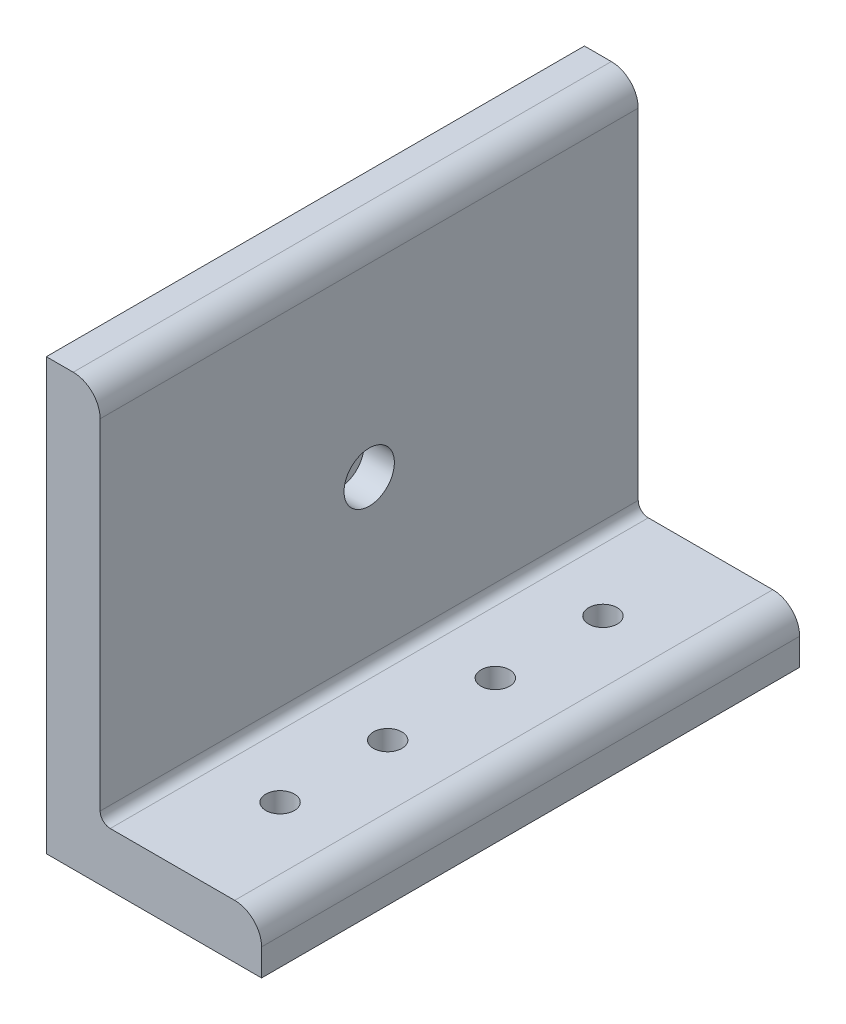
ISO-10303-21;
HEADER;
FILE_DESCRIPTION(('STEP AP214'),'2;1');
FILE_NAME('part.step','',(''),(''),'','','');
FILE_SCHEMA(('AUTOMOTIVE_DESIGN { 1 0 10303 214 1 1 1 1 }'));
ENDSEC;
DATA;
#1=APPLICATION_CONTEXT('core data for automotive mechanical design processes');
#2=APPLICATION_PROTOCOL_DEFINITION('international standard','automotive_design',2000,#1);
#3=PRODUCT_CONTEXT('',#1,'mechanical');
#4=PRODUCT('Part','Part','',(#3));
#5=PRODUCT_RELATED_PRODUCT_CATEGORY('part','',(#4));
#6=PRODUCT_DEFINITION_FORMATION('','',#4);
#7=PRODUCT_DEFINITION_CONTEXT('part definition',#1,'design');
#8=PRODUCT_DEFINITION('design','',#6,#7);
#9=PRODUCT_DEFINITION_SHAPE('','',#8);
#10=(LENGTH_UNIT() NAMED_UNIT(*) SI_UNIT(.MILLI.,.METRE.));
#11=(NAMED_UNIT(*) PLANE_ANGLE_UNIT() SI_UNIT($,.RADIAN.));
#12=(NAMED_UNIT(*) SI_UNIT($,.STERADIAN.) SOLID_ANGLE_UNIT());
#13=UNCERTAINTY_MEASURE_WITH_UNIT(LENGTH_MEASURE(1.E-05),#10,'distance_accuracy_value','');
#14=(GEOMETRIC_REPRESENTATION_CONTEXT(3) GLOBAL_UNCERTAINTY_ASSIGNED_CONTEXT((#13)) GLOBAL_UNIT_ASSIGNED_CONTEXT((#10,
#11,#12)) REPRESENTATION_CONTEXT('',''));
#15=CARTESIAN_POINT('',(0.,0.,0.));
#16=DIRECTION('',(0.,0.,1.));
#17=DIRECTION('',(1.,0.,0.));
#18=AXIS2_PLACEMENT_3D('',#15,#16,#17);
#19=CARTESIAN_POINT('',(421.099925431454,-195.774980879017,94.9361036958903));
#20=DIRECTION('',(0.,-1.,0.));
#21=DIRECTION('',(0.,0.,-1.));
#22=AXIS2_PLACEMENT_3D('',#19,#20,#21);
#23=PLANE('',#22);
#24=CARTESIAN_POINT('',(450.471215431454,-195.774980879017,-108.26389630411));
#25=DIRECTION('',(0.,1.,0.));
#26=DIRECTION('',(0.,0.,1.));
#27=AXIS2_PLACEMENT_3D('',#24,#25,#26);
#28=CIRCLE('',#27,6.74624000000001);
#29=CARTESIAN_POINT('',(450.471215431454,-195.774980879017,-101.51765630411));
#30=VERTEX_POINT('',#29);
#31=EDGE_CURVE('E295',#30,#30,#28,.T.);
#32=ORIENTED_EDGE('',*,*,#31,.F.);
#33=EDGE_LOOP('',(#32));
#34=FACE_BOUND('',#33,.T.);
#35=CARTESIAN_POINT('',(450.471215431454,-195.774980879017,-57.4638963041097));
#36=DIRECTION('',(0.,1.,0.));
#37=DIRECTION('',(0.,0.,1.));
#38=AXIS2_PLACEMENT_3D('',#35,#36,#37);
#39=CIRCLE('',#38,6.74624000000001);
#40=CARTESIAN_POINT('',(450.471215431454,-195.774980879017,-50.7176563041097));
#41=VERTEX_POINT('',#40);
#42=EDGE_CURVE('E287',#41,#41,#39,.T.);
#43=ORIENTED_EDGE('',*,*,#42,.F.);
#44=EDGE_LOOP('',(#43));
#45=FACE_BOUND('',#44,.T.);
#46=CARTESIAN_POINT('',(450.471215431454,-195.774980879017,44.1361036958903));
#47=DIRECTION('',(0.,1.,0.));
#48=DIRECTION('',(0.,0.,1.));
#49=AXIS2_PLACEMENT_3D('',#46,#47,#48);
#50=CIRCLE('',#49,6.74624000000001);
#51=CARTESIAN_POINT('',(450.471215431454,-195.774980879017,50.8823436958903));
#52=VERTEX_POINT('',#51);
#53=EDGE_CURVE('E271',#52,#52,#50,.T.);
#54=ORIENTED_EDGE('',*,*,#53,.F.);
#55=EDGE_LOOP('',(#54));
#56=FACE_BOUND('',#55,.T.);
#57=DIRECTION('',(-1.,0.,0.));
#58=VECTOR('',#57,1.);
#59=CARTESIAN_POINT('',(421.099925431454,-195.774980879017,-159.06389630411));
#60=LINE('',#59,#58);
#61=CARTESIAN_POINT('',(479.842505431454,-195.774980879017,-159.06389630411));
#62=VERTEX_POINT('',#61);
#63=CARTESIAN_POINT('',(421.099925431454,-195.774980879017,-159.06389630411));
#64=VERTEX_POINT('',#63);
#65=EDGE_CURVE('E197',#62,#64,#60,.T.);
#66=ORIENTED_EDGE('',*,*,#65,.T.);
#67=DIRECTION('',(0.,0.,-1.));
#68=VECTOR('',#67,1.);
#69=CARTESIAN_POINT('',(421.099925431454,-195.774980879017,94.9361036958903));
#70=LINE('',#69,#68);
#71=CARTESIAN_POINT('',(421.099925431454,-195.774980879017,94.9361036958903));
#72=VERTEX_POINT('',#71);
#73=EDGE_CURVE('E223',#72,#64,#70,.T.);
#74=ORIENTED_EDGE('',*,*,#73,.F.);
#75=DIRECTION('',(-1.,0.,0.));
#76=VECTOR('',#75,1.);
#77=CARTESIAN_POINT('',(421.099925431454,-195.774980879017,94.9361036958903));
#78=LINE('',#77,#76);
#79=CARTESIAN_POINT('',(479.842505431454,-195.774980879017,94.9361036958903));
#80=VERTEX_POINT('',#79);
#81=EDGE_CURVE('E255',#80,#72,#78,.T.);
#82=ORIENTED_EDGE('',*,*,#81,.F.);
#83=DIRECTION('',(0.,0.,-1.));
#84=VECTOR('',#83,1.);
#85=CARTESIAN_POINT('',(479.842505431454,-195.774980879017,94.9361036958903));
#86=LINE('',#85,#84);
#87=EDGE_CURVE('E227',#80,#62,#86,.T.);
#88=ORIENTED_EDGE('',*,*,#87,.T.);
#89=EDGE_LOOP('',(#66,#74,#82,#88));
#90=FACE_BOUND('',#89,.T.);
#91=CARTESIAN_POINT('',(450.471215431454,-195.774980879017,-6.66389630410971));
#92=DIRECTION('',(0.,1.,0.));
#93=DIRECTION('',(0.,0.,1.));
#94=AXIS2_PLACEMENT_3D('',#91,#92,#93);
#95=CIRCLE('',#94,6.74624000000001);
#96=CARTESIAN_POINT('',(450.471215431454,-195.774980879017,0.0823436958903023));
#97=VERTEX_POINT('',#96);
#98=EDGE_CURVE('E279',#97,#97,#95,.T.);
#99=ORIENTED_EDGE('',*,*,#98,.F.);
#100=EDGE_LOOP('',(#99));
#101=FACE_BOUND('',#100,.T.);
#102=ADVANCED_FACE('F77',(#34,#45,#56,#90,#101),#23,.F.);
#103=CARTESIAN_POINT('',(492.537425431454,-221.174980879017,94.9361036958903));
#104=DIRECTION('',(0.,1.,0.));
#105=DIRECTION('',(0.,0.,1.));
#106=AXIS2_PLACEMENT_3D('',#103,#104,#105);
#107=PLANE('',#106);
#108=CARTESIAN_POINT('',(450.471215431454,-221.174980879017,-108.26389630411));
#109=DIRECTION('',(0.,1.,0.));
#110=DIRECTION('',(0.,0.,1.));
#111=AXIS2_PLACEMENT_3D('',#108,#109,#110);
#112=CIRCLE('',#111,6.74624000000001);
#113=CARTESIAN_POINT('',(450.471215431454,-221.174980879017,-101.51765630411));
#114=VERTEX_POINT('',#113);
#115=EDGE_CURVE('E291',#114,#114,#112,.T.);
#116=ORIENTED_EDGE('',*,*,#115,.T.);
#117=EDGE_LOOP('',(#116));
#118=FACE_BOUND('',#117,.T.);
#119=CARTESIAN_POINT('',(450.471215431454,-221.174980879017,-57.4638963041097));
#120=DIRECTION('',(0.,1.,0.));
#121=DIRECTION('',(0.,0.,1.));
#122=AXIS2_PLACEMENT_3D('',#119,#120,#121);
#123=CIRCLE('',#122,6.74624000000001);
#124=CARTESIAN_POINT('',(450.471215431454,-221.174980879017,-50.7176563041097));
#125=VERTEX_POINT('',#124);
#126=EDGE_CURVE('E283',#125,#125,#123,.T.);
#127=ORIENTED_EDGE('',*,*,#126,.T.);
#128=EDGE_LOOP('',(#127));
#129=FACE_BOUND('',#128,.T.);
#130=CARTESIAN_POINT('',(450.471215431454,-221.174980879017,-6.66389630410971));
#131=DIRECTION('',(0.,1.,0.));
#132=DIRECTION('',(0.,0.,1.));
#133=AXIS2_PLACEMENT_3D('',#130,#131,#132);
#134=CIRCLE('',#133,6.74624000000001);
#135=CARTESIAN_POINT('',(450.471215431454,-221.174980879017,0.0823436958903023));
#136=VERTEX_POINT('',#135);
#137=EDGE_CURVE('E275',#136,#136,#134,.T.);
#138=ORIENTED_EDGE('',*,*,#137,.T.);
#139=EDGE_LOOP('',(#138));
#140=FACE_BOUND('',#139,.T.);
#141=CARTESIAN_POINT('',(450.471215431454,-221.174980879017,44.1361036958903));
#142=DIRECTION('',(0.,1.,0.));
#143=DIRECTION('',(0.,0.,1.));
#144=AXIS2_PLACEMENT_3D('',#141,#142,#143);
#145=CIRCLE('',#144,6.74624000000001);
#146=CARTESIAN_POINT('',(450.471215431454,-221.174980879017,50.8823436958903));
#147=VERTEX_POINT('',#146);
#148=EDGE_CURVE('E191',#147,#147,#145,.T.);
#149=ORIENTED_EDGE('',*,*,#148,.T.);
#150=EDGE_LOOP('',(#149));
#151=FACE_BOUND('',#150,.T.);
#152=DIRECTION('',(1.,0.,0.));
#153=VECTOR('',#152,1.);
#154=CARTESIAN_POINT('',(492.537425431454,-221.174980879017,-159.06389630411));
#155=LINE('',#154,#153);
#156=CARTESIAN_POINT('',(390.937425431454,-221.174980879017,-159.06389630411));
#157=VERTEX_POINT('',#156);
#158=CARTESIAN_POINT('',(492.537425431454,-221.174980879017,-159.06389630411));
#159=VERTEX_POINT('',#158);
#160=EDGE_CURVE('E186',#157,#159,#155,.T.);
#161=ORIENTED_EDGE('',*,*,#160,.T.);
#162=DIRECTION('',(0.,0.,-1.));
#163=VECTOR('',#162,1.);
#164=CARTESIAN_POINT('',(492.537425431454,-221.174980879017,94.9361036958903));
#165=LINE('',#164,#163);
#166=CARTESIAN_POINT('',(492.537425431454,-221.174980879017,94.9361036958903));
#167=VERTEX_POINT('',#166);
#168=EDGE_CURVE('E13',#167,#159,#165,.T.);
#169=ORIENTED_EDGE('',*,*,#168,.F.);
#170=DIRECTION('',(1.,0.,0.));
#171=VECTOR('',#170,1.);
#172=CARTESIAN_POINT('',(492.537425431454,-221.174980879017,94.9361036958903));
#173=LINE('',#172,#171);
#174=CARTESIAN_POINT('',(390.937425431454,-221.174980879017,94.9361036958903));
#175=VERTEX_POINT('',#174);
#176=EDGE_CURVE('E212',#175,#167,#173,.T.);
#177=ORIENTED_EDGE('',*,*,#176,.F.);
#178=DIRECTION('',(0.,0.,-1.));
#179=VECTOR('',#178,1.);
#180=CARTESIAN_POINT('',(390.937425431454,-221.174980879017,94.9361036958903));
#181=LINE('',#180,#179);
#182=EDGE_CURVE('E182',#175,#157,#181,.T.);
#183=ORIENTED_EDGE('',*,*,#182,.T.);
#184=EDGE_LOOP('',(#161,#169,#177,#183));
#185=FACE_BOUND('',#184,.T.);
#186=ADVANCED_FACE('F79',(#118,#129,#140,#151,#185),#107,.F.);
#187=CARTESIAN_POINT('',(492.537425431454,-208.469900879017,94.9361036958903));
#188=DIRECTION('',(-1.,0.,0.));
#189=DIRECTION('',(0.,0.,1.));
#190=AXIS2_PLACEMENT_3D('',#187,#188,#189);
#191=PLANE('',#190);
#192=DIRECTION('',(0.,1.,0.));
#193=VECTOR('',#192,1.);
#194=CARTESIAN_POINT('',(492.537425431454,-208.469900879017,-159.06389630411));
#195=LINE('',#194,#193);
#196=CARTESIAN_POINT('',(492.537425431454,-208.469900879017,-159.06389630411));
#197=VERTEX_POINT('',#196);
#198=EDGE_CURVE('E190',#159,#197,#195,.T.);
#199=ORIENTED_EDGE('',*,*,#198,.T.);
#200=DIRECTION('',(0.,0.,-1.));
#201=VECTOR('',#200,1.);
#202=CARTESIAN_POINT('',(492.537425431454,-208.469900879017,94.9361036958903));
#203=LINE('',#202,#201);
#204=CARTESIAN_POINT('',(492.537425431454,-208.469900879017,94.9361036958903));
#205=VERTEX_POINT('',#204);
#206=EDGE_CURVE('E87',#205,#197,#203,.T.);
#207=ORIENTED_EDGE('',*,*,#206,.F.);
#208=DIRECTION('',(0.,1.,0.));
#209=VECTOR('',#208,1.);
#210=CARTESIAN_POINT('',(492.537425431454,-208.469900879017,94.9361036958903));
#211=LINE('',#210,#209);
#212=EDGE_CURVE('E141',#167,#205,#211,.T.);
#213=ORIENTED_EDGE('',*,*,#212,.F.);
#214=ORIENTED_EDGE('',*,*,#168,.T.);
#215=EDGE_LOOP('',(#199,#207,#213,#214));
#216=FACE_BOUND('',#215,.T.);
#217=ADVANCED_FACE('F345',(#216),#191,.F.);
#218=CARTESIAN_POINT('',(479.842505431454,-208.469900879017,94.9361036958903));
#219=DIRECTION('',(0.,0.,-1.));
#220=DIRECTION('',(-1.,0.,0.));
#221=AXIS2_PLACEMENT_3D('',#218,#219,#220);
#222=CYLINDRICAL_SURFACE('',#221,12.69492);
#223=CARTESIAN_POINT('',(479.842505431454,-208.469900879017,-159.06389630411));
#224=DIRECTION('',(0.,0.,1.));
#225=DIRECTION('',(1.,0.,0.));
#226=AXIS2_PLACEMENT_3D('',#223,#224,#225);
#227=CIRCLE('',#226,12.69492);
#228=EDGE_CURVE('E194',#197,#62,#227,.T.);
#229=ORIENTED_EDGE('',*,*,#228,.T.);
#230=ORIENTED_EDGE('',*,*,#87,.F.);
#231=CARTESIAN_POINT('',(479.842505431454,-208.469900879017,94.9361036958903));
#232=DIRECTION('',(0.,0.,1.));
#233=DIRECTION('',(1.,0.,0.));
#234=AXIS2_PLACEMENT_3D('',#231,#232,#233);
#235=CIRCLE('',#234,12.69492);
#236=EDGE_CURVE('E238',#205,#80,#235,.T.);
#237=ORIENTED_EDGE('',*,*,#236,.F.);
#238=ORIENTED_EDGE('',*,*,#206,.T.);
#239=EDGE_LOOP('',(#229,#230,#237,#238));
#240=FACE_BOUND('',#239,.T.);
#241=ADVANCED_FACE('F236',(#240),#222,.T.);
#242=CARTESIAN_POINT('',(421.099925431454,-191.012480879017,94.9361036958903));
#243=DIRECTION('',(0.,0.,-1.));
#244=DIRECTION('',(-1.,0.,0.));
#245=AXIS2_PLACEMENT_3D('',#242,#243,#244);
#246=CYLINDRICAL_SURFACE('',#245,4.7625);
#247=CARTESIAN_POINT('',(421.099925431454,-191.012480879017,-159.06389630411));
#248=DIRECTION('',(0.,0.,-1.));
#249=DIRECTION('',(-1.,0.,0.));
#250=AXIS2_PLACEMENT_3D('',#247,#248,#249);
#251=CIRCLE('',#250,4.7625);
#252=CARTESIAN_POINT('',(416.337425431454,-191.012480879017,-159.06389630411));
#253=VERTEX_POINT('',#252);
#254=EDGE_CURVE('E200',#64,#253,#251,.T.);
#255=ORIENTED_EDGE('',*,*,#254,.T.);
#256=DIRECTION('',(0.,0.,-1.));
#257=VECTOR('',#256,1.);
#258=CARTESIAN_POINT('',(416.337425431454,-191.012480879017,94.9361036958903));
#259=LINE('',#258,#257);
#260=CARTESIAN_POINT('',(416.337425431454,-191.012480879017,94.9361036958903));
#261=VERTEX_POINT('',#260);
#262=EDGE_CURVE('E219',#261,#253,#259,.T.);
#263=ORIENTED_EDGE('',*,*,#262,.F.);
#264=CARTESIAN_POINT('',(421.099925431454,-191.012480879017,94.9361036958903));
#265=DIRECTION('',(0.,0.,-1.));
#266=DIRECTION('',(-1.,0.,0.));
#267=AXIS2_PLACEMENT_3D('',#264,#265,#266);
#268=CIRCLE('',#267,4.7625);
#269=EDGE_CURVE('E253',#72,#261,#268,.T.);
#270=ORIENTED_EDGE('',*,*,#269,.F.);
#271=ORIENTED_EDGE('',*,*,#73,.T.);
#272=EDGE_LOOP('',(#255,#263,#270,#271));
#273=FACE_BOUND('',#272,.T.);
#274=ADVANCED_FACE('F251',(#273),#246,.F.);
#275=CARTESIAN_POINT('',(416.337425431454,-30.6699008790166,94.9361036958903));
#276=DIRECTION('',(-1.,0.,0.));
#277=DIRECTION('',(0.,0.,1.));
#278=AXIS2_PLACEMENT_3D('',#275,#276,#277);
#279=PLANE('',#278);
#280=CARTESIAN_POINT('',(416.337425431454,-118.000180879017,-32.0638963041097));
#281=DIRECTION('',(1.,0.,0.));
#282=DIRECTION('',(0.,0.,-1.));
#283=AXIS2_PLACEMENT_3D('',#280,#281,#282);
#284=CIRCLE('',#283,11.89);
#285=CARTESIAN_POINT('',(416.337425431454,-118.000180879017,-43.9538963041097));
#286=VERTEX_POINT('',#285);
#287=EDGE_CURVE('E311',#286,#286,#284,.T.);
#288=ORIENTED_EDGE('',*,*,#287,.F.);
#289=EDGE_LOOP('',(#288));
#290=FACE_BOUND('',#289,.T.);
#291=DIRECTION('',(0.,1.,0.));
#292=VECTOR('',#291,1.);
#293=CARTESIAN_POINT('',(416.337425431454,-30.6699008790166,-159.06389630411));
#294=LINE('',#293,#292);
#295=CARTESIAN_POINT('',(416.337425431454,-30.6699008790166,-159.06389630411));
#296=VERTEX_POINT('',#295);
#297=EDGE_CURVE('E203',#253,#296,#294,.T.);
#298=ORIENTED_EDGE('',*,*,#297,.T.);
#299=DIRECTION('',(0.,0.,-1.));
#300=VECTOR('',#299,1.);
#301=CARTESIAN_POINT('',(416.337425431454,-30.6699008790166,94.9361036958903));
#302=LINE('',#301,#300);
#303=CARTESIAN_POINT('',(416.337425431454,-30.6699008790166,94.9361036958903));
#304=VERTEX_POINT('',#303);
#305=EDGE_CURVE('E174',#304,#296,#302,.T.);
#306=ORIENTED_EDGE('',*,*,#305,.F.);
#307=DIRECTION('',(0.,1.,0.));
#308=VECTOR('',#307,1.);
#309=CARTESIAN_POINT('',(416.337425431454,-30.6699008790166,94.9361036958903));
#310=LINE('',#309,#308);
#311=EDGE_CURVE('E163',#261,#304,#310,.T.);
#312=ORIENTED_EDGE('',*,*,#311,.F.);
#313=ORIENTED_EDGE('',*,*,#262,.T.);
#314=EDGE_LOOP('',(#298,#306,#312,#313));
#315=FACE_BOUND('',#314,.T.);
#316=ADVANCED_FACE('F319',(#290,#315),#279,.F.);
#317=CARTESIAN_POINT('',(403.642505431454,-30.6699008790166,94.9361036958903));
#318=DIRECTION('',(0.,0.,-1.));
#319=DIRECTION('',(-1.,0.,0.));
#320=AXIS2_PLACEMENT_3D('',#317,#318,#319);
#321=CYLINDRICAL_SURFACE('',#320,12.69492);
#322=CARTESIAN_POINT('',(403.642505431454,-30.6699008790166,-159.06389630411));
#323=DIRECTION('',(0.,0.,1.));
#324=DIRECTION('',(-1.,0.,0.));
#325=AXIS2_PLACEMENT_3D('',#322,#323,#324);
#326=CIRCLE('',#325,12.69492);
#327=CARTESIAN_POINT('',(403.642505431454,-17.9749808790166,-159.06389630411));
#328=VERTEX_POINT('',#327);
#329=EDGE_CURVE('E172',#296,#328,#326,.T.);
#330=ORIENTED_EDGE('',*,*,#329,.T.);
#331=DIRECTION('',(0.,0.,-1.));
#332=VECTOR('',#331,1.);
#333=CARTESIAN_POINT('',(403.642505431454,-17.9749808790166,94.9361036958903));
#334=LINE('',#333,#332);
#335=CARTESIAN_POINT('',(403.642505431454,-17.9749808790166,94.9361036958903));
#336=VERTEX_POINT('',#335);
#337=EDGE_CURVE('E169',#336,#328,#334,.T.);
#338=ORIENTED_EDGE('',*,*,#337,.F.);
#339=CARTESIAN_POINT('',(403.642505431454,-30.6699008790166,94.9361036958903));
#340=DIRECTION('',(0.,0.,1.));
#341=DIRECTION('',(-1.,0.,0.));
#342=AXIS2_PLACEMENT_3D('',#339,#340,#341);
#343=CIRCLE('',#342,12.69492);
#344=EDGE_CURVE('E157',#304,#336,#343,.T.);
#345=ORIENTED_EDGE('',*,*,#344,.F.);
#346=ORIENTED_EDGE('',*,*,#305,.T.);
#347=EDGE_LOOP('',(#330,#338,#345,#346));
#348=FACE_BOUND('',#347,.T.);
#349=ADVANCED_FACE('F170',(#348),#321,.T.);
#350=CARTESIAN_POINT('',(390.937425431454,-17.9749808790166,94.9361036958903));
#351=DIRECTION('',(0.,-1.,0.));
#352=DIRECTION('',(0.,0.,-1.));
#353=AXIS2_PLACEMENT_3D('',#350,#351,#352);
#354=PLANE('',#353);
#355=DIRECTION('',(-1.,0.,0.));
#356=VECTOR('',#355,1.);
#357=CARTESIAN_POINT('',(390.937425431454,-17.9749808790166,-159.06389630411));
#358=LINE('',#357,#356);
#359=CARTESIAN_POINT('',(390.937425431454,-17.9749808790166,-159.06389630411));
#360=VERTEX_POINT('',#359);
#361=EDGE_CURVE('E127',#328,#360,#358,.T.);
#362=ORIENTED_EDGE('',*,*,#361,.T.);
#363=DIRECTION('',(0.,0.,-1.));
#364=VECTOR('',#363,1.);
#365=CARTESIAN_POINT('',(390.937425431454,-17.9749808790166,94.9361036958903));
#366=LINE('',#365,#364);
#367=CARTESIAN_POINT('',(390.937425431454,-17.9749808790166,94.9361036958903));
#368=VERTEX_POINT('',#367);
#369=EDGE_CURVE('E175',#368,#360,#366,.T.);
#370=ORIENTED_EDGE('',*,*,#369,.F.);
#371=DIRECTION('',(-1.,0.,0.));
#372=VECTOR('',#371,1.);
#373=CARTESIAN_POINT('',(390.937425431454,-17.9749808790166,94.9361036958903));
#374=LINE('',#373,#372);
#375=EDGE_CURVE('E161',#336,#368,#374,.T.);
#376=ORIENTED_EDGE('',*,*,#375,.F.);
#377=ORIENTED_EDGE('',*,*,#337,.T.);
#378=EDGE_LOOP('',(#362,#370,#376,#377));
#379=FACE_BOUND('',#378,.T.);
#380=ADVANCED_FACE('F177',(#379),#354,.F.);
#381=CARTESIAN_POINT('',(390.937425431454,-221.174980879017,94.9361036958903));
#382=DIRECTION('',(1.,0.,0.));
#383=DIRECTION('',(0.,1.,0.));
#384=AXIS2_PLACEMENT_3D('',#381,#382,#383);
#385=PLANE('',#384);
#386=CARTESIAN_POINT('',(390.937425431454,-118.000180879017,-32.0638963041097));
#387=DIRECTION('',(1.,0.,0.));
#388=DIRECTION('',(0.,0.,-1.));
#389=AXIS2_PLACEMENT_3D('',#386,#387,#388);
#390=CIRCLE('',#389,6.74999999999999);
#391=CARTESIAN_POINT('',(390.937425431454,-118.000180879017,-38.8138963041097));
#392=VERTEX_POINT('',#391);
#393=EDGE_CURVE('E299',#392,#392,#390,.T.);
#394=ORIENTED_EDGE('',*,*,#393,.T.);
#395=EDGE_LOOP('',(#394));
#396=FACE_BOUND('',#395,.T.);
#397=DIRECTION('',(0.,-1.,0.));
#398=VECTOR('',#397,1.);
#399=CARTESIAN_POINT('',(390.937425431454,-221.174980879017,-159.06389630411));
#400=LINE('',#399,#398);
#401=EDGE_CURVE('E133',#360,#157,#400,.T.);
#402=ORIENTED_EDGE('',*,*,#401,.T.);
#403=ORIENTED_EDGE('',*,*,#182,.F.);
#404=DIRECTION('',(0.,-1.,0.));
#405=VECTOR('',#404,1.);
#406=CARTESIAN_POINT('',(390.937425431454,-221.174980879017,94.9361036958903));
#407=LINE('',#406,#405);
#408=EDGE_CURVE('E95',#368,#175,#407,.T.);
#409=ORIENTED_EDGE('',*,*,#408,.F.);
#410=ORIENTED_EDGE('',*,*,#369,.T.);
#411=EDGE_LOOP('',(#402,#403,#409,#410));
#412=FACE_BOUND('',#411,.T.);
#413=ADVANCED_FACE('F326',(#396,#412),#385,.F.);
#414=CARTESIAN_POINT('',(403.642505431454,-30.6699008790166,94.9361036958903));
#415=DIRECTION('',(0.,0.,-1.));
#416=DIRECTION('',(-1.,0.,0.));
#417=AXIS2_PLACEMENT_3D('',#414,#415,#416);
#418=PLANE('',#417);
#419=ORIENTED_EDGE('',*,*,#176,.T.);
#420=ORIENTED_EDGE('',*,*,#212,.T.);
#421=ORIENTED_EDGE('',*,*,#236,.T.);
#422=ORIENTED_EDGE('',*,*,#81,.T.);
#423=ORIENTED_EDGE('',*,*,#269,.T.);
#424=ORIENTED_EDGE('',*,*,#311,.T.);
#425=ORIENTED_EDGE('',*,*,#344,.T.);
#426=ORIENTED_EDGE('',*,*,#375,.T.);
#427=ORIENTED_EDGE('',*,*,#408,.T.);
#428=EDGE_LOOP('',(#419,#420,#421,#422,#423,#424,#425,#426,#427));
#429=FACE_BOUND('',#428,.T.);
#430=ADVANCED_FACE('F159',(#429),#418,.F.);
#431=CARTESIAN_POINT('',(403.642505431454,-30.6699008790166,-159.06389630411));
#432=DIRECTION('',(0.,0.,-1.));
#433=DIRECTION('',(-1.,0.,0.));
#434=AXIS2_PLACEMENT_3D('',#431,#432,#433);
#435=PLANE('',#434);
#436=ORIENTED_EDGE('',*,*,#160,.F.);
#437=ORIENTED_EDGE('',*,*,#401,.F.);
#438=ORIENTED_EDGE('',*,*,#361,.F.);
#439=ORIENTED_EDGE('',*,*,#329,.F.);
#440=ORIENTED_EDGE('',*,*,#297,.F.);
#441=ORIENTED_EDGE('',*,*,#254,.F.);
#442=ORIENTED_EDGE('',*,*,#65,.F.);
#443=ORIENTED_EDGE('',*,*,#228,.F.);
#444=ORIENTED_EDGE('',*,*,#198,.F.);
#445=EDGE_LOOP('',(#436,#437,#438,#439,#440,#441,#442,#443,#444));
#446=FACE_BOUND('',#445,.T.);
#447=ADVANCED_FACE('F242',(#446),#435,.T.);
#448=CARTESIAN_POINT('',(450.471215431454,-195.774980879017,44.1361036958903));
#449=DIRECTION('',(0.,1.,0.));
#450=DIRECTION('',(0.,0.,1.));
#451=AXIS2_PLACEMENT_3D('',#448,#449,#450);
#452=CYLINDRICAL_SURFACE('',#451,6.74624000000001);
#453=ORIENTED_EDGE('',*,*,#148,.F.);
#454=EDGE_LOOP('',(#453));
#455=FACE_BOUND('',#454,.T.);
#456=ORIENTED_EDGE('',*,*,#53,.T.);
#457=EDGE_LOOP('',(#456));
#458=FACE_BOUND('',#457,.T.);
#459=ADVANCED_FACE('F390',(#455,#458),#452,.F.);
#460=CARTESIAN_POINT('',(450.471215431454,-195.774980879017,-6.66389630410971));
#461=DIRECTION('',(0.,1.,0.));
#462=DIRECTION('',(0.,0.,1.));
#463=AXIS2_PLACEMENT_3D('',#460,#461,#462);
#464=CYLINDRICAL_SURFACE('',#463,6.74624000000001);
#465=ORIENTED_EDGE('',*,*,#137,.F.);
#466=EDGE_LOOP('',(#465));
#467=FACE_BOUND('',#466,.T.);
#468=ORIENTED_EDGE('',*,*,#98,.T.);
#469=EDGE_LOOP('',(#468));
#470=FACE_BOUND('',#469,.T.);
#471=ADVANCED_FACE('F407',(#467,#470),#464,.F.);
#472=CARTESIAN_POINT('',(450.471215431454,-195.774980879017,-57.4638963041097));
#473=DIRECTION('',(0.,1.,0.));
#474=DIRECTION('',(0.,0.,1.));
#475=AXIS2_PLACEMENT_3D('',#472,#473,#474);
#476=CYLINDRICAL_SURFACE('',#475,6.74624000000001);
#477=ORIENTED_EDGE('',*,*,#126,.F.);
#478=EDGE_LOOP('',(#477));
#479=FACE_BOUND('',#478,.T.);
#480=ORIENTED_EDGE('',*,*,#42,.T.);
#481=EDGE_LOOP('',(#480));
#482=FACE_BOUND('',#481,.T.);
#483=ADVANCED_FACE('F417',(#479,#482),#476,.F.);
#484=CARTESIAN_POINT('',(450.471215431454,-195.774980879017,-108.26389630411));
#485=DIRECTION('',(0.,1.,0.));
#486=DIRECTION('',(0.,0.,1.));
#487=AXIS2_PLACEMENT_3D('',#484,#485,#486);
#488=CYLINDRICAL_SURFACE('',#487,6.74624000000001);
#489=ORIENTED_EDGE('',*,*,#115,.F.);
#490=EDGE_LOOP('',(#489));
#491=FACE_BOUND('',#490,.T.);
#492=ORIENTED_EDGE('',*,*,#31,.T.);
#493=EDGE_LOOP('',(#492));
#494=FACE_BOUND('',#493,.T.);
#495=ADVANCED_FACE('F427',(#491,#494),#488,.F.);
#496=CARTESIAN_POINT('',(416.337425431454,-118.000180879017,-32.0638963041097));
#497=DIRECTION('',(1.,0.,0.));
#498=DIRECTION('',(0.,0.,-1.));
#499=AXIS2_PLACEMENT_3D('',#496,#497,#498);
#500=CYLINDRICAL_SURFACE('',#499,6.74999999999999);
#501=ORIENTED_EDGE('',*,*,#393,.F.);
#502=EDGE_LOOP('',(#501));
#503=FACE_BOUND('',#502,.T.);
#504=CARTESIAN_POINT('',(402.037425431454,-118.000180879017,-32.0638963041097));
#505=DIRECTION('',(1.,0.,0.));
#506=DIRECTION('',(0.,0.,-1.));
#507=AXIS2_PLACEMENT_3D('',#504,#505,#506);
#508=CIRCLE('',#507,6.74999999999999);
#509=CARTESIAN_POINT('',(402.037425431454,-118.000180879017,-38.8138963041097));
#510=VERTEX_POINT('',#509);
#511=EDGE_CURVE('E303',#510,#510,#508,.T.);
#512=ORIENTED_EDGE('',*,*,#511,.T.);
#513=EDGE_LOOP('',(#512));
#514=FACE_BOUND('',#513,.T.);
#515=ADVANCED_FACE('F437',(#503,#514),#500,.F.);
#516=CARTESIAN_POINT('',(402.037425431454,-111.250180879017,-32.0638963041097));
#517=DIRECTION('',(-1.,0.,0.));
#518=DIRECTION('',(0.,0.,1.));
#519=AXIS2_PLACEMENT_3D('',#516,#517,#518);
#520=PLANE('',#519);
#521=ORIENTED_EDGE('',*,*,#511,.F.);
#522=EDGE_LOOP('',(#521));
#523=FACE_BOUND('',#522,.T.);
#524=CARTESIAN_POINT('',(402.037425431454,-118.000180879017,-32.0638963041097));
#525=DIRECTION('',(1.,0.,0.));
#526=DIRECTION('',(0.,0.,-1.));
#527=AXIS2_PLACEMENT_3D('',#524,#525,#526);
#528=CIRCLE('',#527,11.89);
#529=CARTESIAN_POINT('',(402.037425431454,-118.000180879017,-43.9538963041097));
#530=VERTEX_POINT('',#529);
#531=EDGE_CURVE('E307',#530,#530,#528,.T.);
#532=ORIENTED_EDGE('',*,*,#531,.T.);
#533=EDGE_LOOP('',(#532));
#534=FACE_BOUND('',#533,.T.);
#535=ADVANCED_FACE('F446',(#523,#534),#520,.F.);
#536=CARTESIAN_POINT('',(416.337425431454,-118.000180879017,-32.0638963041097));
#537=DIRECTION('',(1.,0.,0.));
#538=DIRECTION('',(0.,0.,-1.));
#539=AXIS2_PLACEMENT_3D('',#536,#537,#538);
#540=CYLINDRICAL_SURFACE('',#539,11.89);
#541=ORIENTED_EDGE('',*,*,#531,.F.);
#542=EDGE_LOOP('',(#541));
#543=FACE_BOUND('',#542,.T.);
#544=ORIENTED_EDGE('',*,*,#287,.T.);
#545=EDGE_LOOP('',(#544));
#546=FACE_BOUND('',#545,.T.);
#547=ADVANCED_FACE('F317',(#543,#546),#540,.F.);
#548=CLOSED_SHELL('',(#102,#186,#217,#241,#274,#316,#349,#380,#413,#430,#447,#459,#471,#483,
#495,#515,#535,#547));
#549=MANIFOLD_SOLID_BREP('B2',#548);
#550=ADVANCED_BREP_SHAPE_REPRESENTATION('',(#18,#549),#14);
#551=SHAPE_DEFINITION_REPRESENTATION(#9,#550);
ENDSEC;
END-ISO-10303-21;
